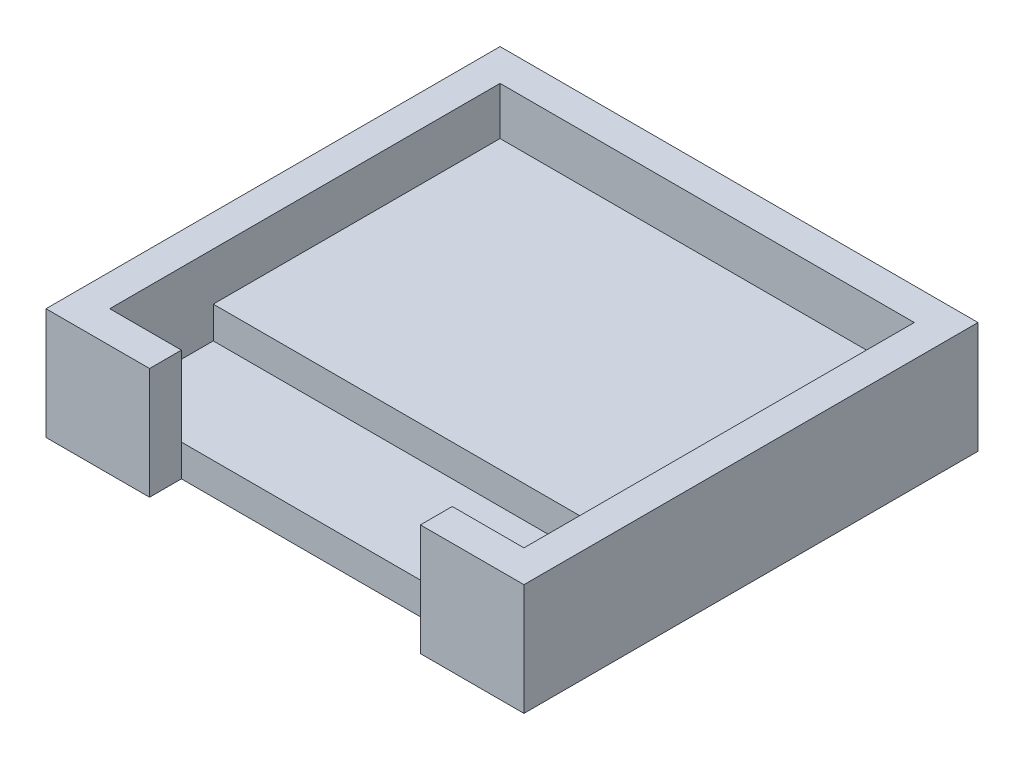
ISO-10303-21;
HEADER;
FILE_DESCRIPTION(('STEP AP214'),'2;1');
FILE_NAME('part.step','',(''),(''),'','','');
FILE_SCHEMA(('AUTOMOTIVE_DESIGN { 1 0 10303 214 1 1 1 1 }'));
ENDSEC;
DATA;
#1=APPLICATION_CONTEXT('core data for automotive mechanical design processes');
#2=APPLICATION_PROTOCOL_DEFINITION('international standard','automotive_design',2000,#1);
#3=PRODUCT_CONTEXT('',#1,'mechanical');
#4=PRODUCT('Part','Part','',(#3));
#5=PRODUCT_RELATED_PRODUCT_CATEGORY('part','',(#4));
#6=PRODUCT_DEFINITION_FORMATION('','',#4);
#7=PRODUCT_DEFINITION_CONTEXT('part definition',#1,'design');
#8=PRODUCT_DEFINITION('design','',#6,#7);
#9=PRODUCT_DEFINITION_SHAPE('','',#8);
#10=(LENGTH_UNIT() NAMED_UNIT(*) SI_UNIT(.MILLI.,.METRE.));
#11=(NAMED_UNIT(*) PLANE_ANGLE_UNIT() SI_UNIT($,.RADIAN.));
#12=(NAMED_UNIT(*) SI_UNIT($,.STERADIAN.) SOLID_ANGLE_UNIT());
#13=UNCERTAINTY_MEASURE_WITH_UNIT(LENGTH_MEASURE(1.E-05),#10,'distance_accuracy_value','');
#14=(GEOMETRIC_REPRESENTATION_CONTEXT(3) GLOBAL_UNCERTAINTY_ASSIGNED_CONTEXT((#13)) GLOBAL_UNIT_ASSIGNED_CONTEXT((#10,
#11,#12)) REPRESENTATION_CONTEXT('',''));
#15=CARTESIAN_POINT('',(0.,0.,0.));
#16=DIRECTION('',(0.,0.,1.));
#17=DIRECTION('',(1.,0.,0.));
#18=AXIS2_PLACEMENT_3D('',#15,#16,#17);
#19=CARTESIAN_POINT('',(0.,7.,0.));
#20=DIRECTION('',(-1.,0.,0.));
#21=DIRECTION('',(0.,0.,1.));
#22=AXIS2_PLACEMENT_3D('',#19,#20,#21);
#23=PLANE('',#22);
#24=DIRECTION('',(0.,-1.,0.));
#25=VECTOR('',#24,1.);
#26=CARTESIAN_POINT('',(0.,4.,-6.5));
#27=LINE('',#26,#25);
#28=CARTESIAN_POINT('',(0.,4.,-6.5));
#29=VERTEX_POINT('',#28);
#30=CARTESIAN_POINT('',(0.,2.,-6.5));
#31=VERTEX_POINT('',#30);
#32=EDGE_CURVE('E50',#29,#31,#27,.T.);
#33=ORIENTED_EDGE('',*,*,#32,.F.);
#34=DIRECTION('',(0.,0.,-1.));
#35=VECTOR('',#34,1.);
#36=CARTESIAN_POINT('',(0.,4.,0.));
#37=LINE('',#36,#35);
#38=CARTESIAN_POINT('',(0.,4.,-24.5));
#39=VERTEX_POINT('',#38);
#40=EDGE_CURVE('E55',#29,#39,#37,.T.);
#41=ORIENTED_EDGE('',*,*,#40,.T.);
#42=DIRECTION('',(0.,-1.,0.));
#43=VECTOR('',#42,1.);
#44=CARTESIAN_POINT('',(0.,7.,-24.5));
#45=LINE('',#44,#43);
#46=CARTESIAN_POINT('',(0.,7.,-24.5));
#47=VERTEX_POINT('',#46);
#48=EDGE_CURVE('E228',#47,#39,#45,.T.);
#49=ORIENTED_EDGE('',*,*,#48,.F.);
#50=DIRECTION('',(0.,0.,-1.));
#51=VECTOR('',#50,1.);
#52=CARTESIAN_POINT('',(0.,7.,0.));
#53=LINE('',#52,#51);
#54=CARTESIAN_POINT('',(0.,7.,0.));
#55=VERTEX_POINT('',#54);
#56=EDGE_CURVE('E200',#55,#47,#53,.T.);
#57=ORIENTED_EDGE('',*,*,#56,.F.);
#58=DIRECTION('',(0.,-1.,0.));
#59=VECTOR('',#58,1.);
#60=CARTESIAN_POINT('',(0.,7.,0.));
#61=LINE('',#60,#59);
#62=CARTESIAN_POINT('',(0.,2.,0.));
#63=VERTEX_POINT('',#62);
#64=EDGE_CURVE('E230',#55,#63,#61,.T.);
#65=ORIENTED_EDGE('',*,*,#64,.T.);
#66=DIRECTION('',(0.,0.,-1.));
#67=VECTOR('',#66,1.);
#68=CARTESIAN_POINT('',(0.,2.,0.));
#69=LINE('',#68,#67);
#70=EDGE_CURVE('E167',#63,#31,#69,.T.);
#71=ORIENTED_EDGE('',*,*,#70,.T.);
#72=EDGE_LOOP('',(#33,#41,#49,#57,#65,#71));
#73=FACE_BOUND('',#72,.T.);
#74=ADVANCED_FACE('F35',(#73),#23,.F.);
#75=CARTESIAN_POINT('',(26.,7.,0.));
#76=DIRECTION('',(-1.,0.,0.));
#77=DIRECTION('',(0.,0.,1.));
#78=AXIS2_PLACEMENT_3D('',#75,#76,#77);
#79=PLANE('',#78);
#80=DIRECTION('',(0.,0.,-1.));
#81=VECTOR('',#80,1.);
#82=CARTESIAN_POINT('',(26.,4.,0.));
#83=LINE('',#82,#81);
#84=CARTESIAN_POINT('',(26.,4.,-6.5));
#85=VERTEX_POINT('',#84);
#86=CARTESIAN_POINT('',(26.,4.,-24.5));
#87=VERTEX_POINT('',#86);
#88=EDGE_CURVE('E161',#85,#87,#83,.T.);
#89=ORIENTED_EDGE('',*,*,#88,.F.);
#90=DIRECTION('',(0.,-1.,0.));
#91=VECTOR('',#90,1.);
#92=CARTESIAN_POINT('',(26.,4.,-6.5));
#93=LINE('',#92,#91);
#94=CARTESIAN_POINT('',(26.,2.,-6.5));
#95=VERTEX_POINT('',#94);
#96=EDGE_CURVE('E157',#85,#95,#93,.T.);
#97=ORIENTED_EDGE('',*,*,#96,.T.);
#98=DIRECTION('',(0.,0.,-1.));
#99=VECTOR('',#98,1.);
#100=CARTESIAN_POINT('',(26.,2.,0.));
#101=LINE('',#100,#99);
#102=CARTESIAN_POINT('',(26.,2.,0.));
#103=VERTEX_POINT('',#102);
#104=EDGE_CURVE('E142',#103,#95,#101,.T.);
#105=ORIENTED_EDGE('',*,*,#104,.F.);
#106=DIRECTION('',(0.,-1.,0.));
#107=VECTOR('',#106,1.);
#108=CARTESIAN_POINT('',(26.,7.,0.));
#109=LINE('',#108,#107);
#110=CARTESIAN_POINT('',(26.,7.,0.));
#111=VERTEX_POINT('',#110);
#112=EDGE_CURVE('E207',#111,#103,#109,.T.);
#113=ORIENTED_EDGE('',*,*,#112,.F.);
#114=DIRECTION('',(0.,0.,-1.));
#115=VECTOR('',#114,1.);
#116=CARTESIAN_POINT('',(26.,7.,0.));
#117=LINE('',#116,#115);
#118=CARTESIAN_POINT('',(26.,7.,-24.5));
#119=VERTEX_POINT('',#118);
#120=EDGE_CURVE('E204',#111,#119,#117,.T.);
#121=ORIENTED_EDGE('',*,*,#120,.T.);
#122=DIRECTION('',(0.,-1.,0.));
#123=VECTOR('',#122,1.);
#124=CARTESIAN_POINT('',(26.,7.,-24.5));
#125=LINE('',#124,#123);
#126=EDGE_CURVE('E226',#119,#87,#125,.T.);
#127=ORIENTED_EDGE('',*,*,#126,.T.);
#128=EDGE_LOOP('',(#89,#97,#105,#113,#121,#127));
#129=FACE_BOUND('',#128,.T.);
#130=ADVANCED_FACE('F158',(#129),#79,.T.);
#131=CARTESIAN_POINT('',(0.,7.,0.));
#132=DIRECTION('',(0.,0.,-1.));
#133=DIRECTION('',(-1.,0.,0.));
#134=AXIS2_PLACEMENT_3D('',#131,#132,#133);
#135=PLANE('',#134);
#136=DIRECTION('',(1.,0.,0.));
#137=VECTOR('',#136,1.);
#138=CARTESIAN_POINT('',(0.,2.,0.));
#139=LINE('',#138,#137);
#140=CARTESIAN_POINT('',(21.5,2.,0.));
#141=VERTEX_POINT('',#140);
#142=EDGE_CURVE('E151',#141,#103,#139,.T.);
#143=ORIENTED_EDGE('',*,*,#142,.F.);
#144=DIRECTION('',(0.,-1.,0.));
#145=VECTOR('',#144,1.);
#146=CARTESIAN_POINT('',(21.5,7.,0.));
#147=LINE('',#146,#145);
#148=CARTESIAN_POINT('',(21.5,7.,0.));
#149=VERTEX_POINT('',#148);
#150=EDGE_CURVE('E11',#149,#141,#147,.T.);
#151=ORIENTED_EDGE('',*,*,#150,.F.);
#152=DIRECTION('',(1.,0.,0.));
#153=VECTOR('',#152,1.);
#154=CARTESIAN_POINT('',(0.,7.,0.));
#155=LINE('',#154,#153);
#156=EDGE_CURVE('E178',#149,#111,#155,.T.);
#157=ORIENTED_EDGE('',*,*,#156,.T.);
#158=ORIENTED_EDGE('',*,*,#112,.T.);
#159=EDGE_LOOP('',(#143,#151,#157,#158));
#160=FACE_BOUND('',#159,.T.);
#161=ADVANCED_FACE('F273',(#160),#135,.T.);
#162=CARTESIAN_POINT('',(21.5,7.,0.));
#163=DIRECTION('',(1.,0.,0.));
#164=DIRECTION('',(0.,0.,-1.));
#165=AXIS2_PLACEMENT_3D('',#162,#163,#164);
#166=PLANE('',#165);
#167=DIRECTION('',(0.,0.,1.));
#168=VECTOR('',#167,1.);
#169=CARTESIAN_POINT('',(21.5,0.,0.));
#170=LINE('',#169,#168);
#171=CARTESIAN_POINT('',(21.5,0.,0.));
#172=VERTEX_POINT('',#171);
#173=CARTESIAN_POINT('',(21.5,0.,2.));
#174=VERTEX_POINT('',#173);
#175=EDGE_CURVE('E177',#172,#174,#170,.T.);
#176=ORIENTED_EDGE('',*,*,#175,.T.);
#177=DIRECTION('',(0.,-1.,0.));
#178=VECTOR('',#177,1.);
#179=CARTESIAN_POINT('',(21.5,7.,2.));
#180=LINE('',#179,#178);
#181=CARTESIAN_POINT('',(21.5,7.,2.));
#182=VERTEX_POINT('',#181);
#183=EDGE_CURVE('E43',#182,#174,#180,.T.);
#184=ORIENTED_EDGE('',*,*,#183,.F.);
#185=DIRECTION('',(0.,0.,1.));
#186=VECTOR('',#185,1.);
#187=CARTESIAN_POINT('',(21.5,7.,0.));
#188=LINE('',#187,#186);
#189=EDGE_CURVE('E181',#149,#182,#188,.T.);
#190=ORIENTED_EDGE('',*,*,#189,.F.);
#191=ORIENTED_EDGE('',*,*,#150,.T.);
#192=DIRECTION('',(0.,1.,0.));
#193=VECTOR('',#192,1.);
#194=CARTESIAN_POINT('',(21.5,7.,0.));
#195=LINE('',#194,#193);
#196=EDGE_CURVE('E175',#172,#141,#195,.T.);
#197=ORIENTED_EDGE('',*,*,#196,.F.);
#198=EDGE_LOOP('',(#176,#184,#190,#191,#197));
#199=FACE_BOUND('',#198,.T.);
#200=ADVANCED_FACE('F37',(#199),#166,.F.);
#201=CARTESIAN_POINT('',(0.,7.,2.));
#202=DIRECTION('',(0.,0.,-1.));
#203=DIRECTION('',(-1.,0.,0.));
#204=AXIS2_PLACEMENT_3D('',#201,#202,#203);
#205=PLANE('',#204);
#206=DIRECTION('',(1.,0.,0.));
#207=VECTOR('',#206,1.);
#208=CARTESIAN_POINT('',(0.,0.,2.));
#209=LINE('',#208,#207);
#210=CARTESIAN_POINT('',(28.,0.,2.));
#211=VERTEX_POINT('',#210);
#212=EDGE_CURVE('E209',#174,#211,#209,.T.);
#213=ORIENTED_EDGE('',*,*,#212,.T.);
#214=DIRECTION('',(0.,-1.,0.));
#215=VECTOR('',#214,1.);
#216=CARTESIAN_POINT('',(28.,7.,2.));
#217=LINE('',#216,#215);
#218=CARTESIAN_POINT('',(28.,7.,2.));
#219=VERTEX_POINT('',#218);
#220=EDGE_CURVE('E244',#219,#211,#217,.T.);
#221=ORIENTED_EDGE('',*,*,#220,.F.);
#222=DIRECTION('',(1.,0.,0.));
#223=VECTOR('',#222,1.);
#224=CARTESIAN_POINT('',(0.,7.,2.));
#225=LINE('',#224,#223);
#226=EDGE_CURVE('E185',#182,#219,#225,.T.);
#227=ORIENTED_EDGE('',*,*,#226,.F.);
#228=ORIENTED_EDGE('',*,*,#183,.T.);
#229=EDGE_LOOP('',(#213,#221,#227,#228));
#230=FACE_BOUND('',#229,.T.);
#231=ADVANCED_FACE('F251',(#230),#205,.F.);
#232=CARTESIAN_POINT('',(28.,7.,0.));
#233=DIRECTION('',(-1.,0.,0.));
#234=DIRECTION('',(0.,0.,1.));
#235=AXIS2_PLACEMENT_3D('',#232,#233,#234);
#236=PLANE('',#235);
#237=DIRECTION('',(0.,0.,-1.));
#238=VECTOR('',#237,1.);
#239=CARTESIAN_POINT('',(28.,0.,0.));
#240=LINE('',#239,#238);
#241=CARTESIAN_POINT('',(28.,0.,-26.5));
#242=VERTEX_POINT('',#241);
#243=EDGE_CURVE('E211',#211,#242,#240,.T.);
#244=ORIENTED_EDGE('',*,*,#243,.T.);
#245=DIRECTION('',(0.,-1.,0.));
#246=VECTOR('',#245,1.);
#247=CARTESIAN_POINT('',(28.,7.,-26.5));
#248=LINE('',#247,#246);
#249=CARTESIAN_POINT('',(28.,7.,-26.5));
#250=VERTEX_POINT('',#249);
#251=EDGE_CURVE('E242',#250,#242,#248,.T.);
#252=ORIENTED_EDGE('',*,*,#251,.F.);
#253=DIRECTION('',(0.,0.,-1.));
#254=VECTOR('',#253,1.);
#255=CARTESIAN_POINT('',(28.,7.,0.));
#256=LINE('',#255,#254);
#257=EDGE_CURVE('E187',#219,#250,#256,.T.);
#258=ORIENTED_EDGE('',*,*,#257,.F.);
#259=ORIENTED_EDGE('',*,*,#220,.T.);
#260=EDGE_LOOP('',(#244,#252,#258,#259));
#261=FACE_BOUND('',#260,.T.);
#262=ADVANCED_FACE('F263',(#261),#236,.F.);
#263=CARTESIAN_POINT('',(0.,7.,-26.5));
#264=DIRECTION('',(0.,0.,-1.));
#265=DIRECTION('',(-1.,0.,0.));
#266=AXIS2_PLACEMENT_3D('',#263,#264,#265);
#267=PLANE('',#266);
#268=DIRECTION('',(1.,0.,0.));
#269=VECTOR('',#268,1.);
#270=CARTESIAN_POINT('',(0.,0.,-26.5));
#271=LINE('',#270,#269);
#272=CARTESIAN_POINT('',(-2.,0.,-26.5));
#273=VERTEX_POINT('',#272);
#274=EDGE_CURVE('E214',#273,#242,#271,.T.);
#275=ORIENTED_EDGE('',*,*,#274,.F.);
#276=DIRECTION('',(0.,-1.,0.));
#277=VECTOR('',#276,1.);
#278=CARTESIAN_POINT('',(-2.,7.,-26.5));
#279=LINE('',#278,#277);
#280=CARTESIAN_POINT('',(-2.,7.,-26.5));
#281=VERTEX_POINT('',#280);
#282=EDGE_CURVE('E240',#281,#273,#279,.T.);
#283=ORIENTED_EDGE('',*,*,#282,.F.);
#284=DIRECTION('',(1.,0.,0.));
#285=VECTOR('',#284,1.);
#286=CARTESIAN_POINT('',(0.,7.,-26.5));
#287=LINE('',#286,#285);
#288=EDGE_CURVE('E189',#281,#250,#287,.T.);
#289=ORIENTED_EDGE('',*,*,#288,.T.);
#290=ORIENTED_EDGE('',*,*,#251,.T.);
#291=EDGE_LOOP('',(#275,#283,#289,#290));
#292=FACE_BOUND('',#291,.T.);
#293=ADVANCED_FACE('F296',(#292),#267,.T.);
#294=CARTESIAN_POINT('',(-2.,7.,0.));
#295=DIRECTION('',(-1.,0.,0.));
#296=DIRECTION('',(0.,0.,1.));
#297=AXIS2_PLACEMENT_3D('',#294,#295,#296);
#298=PLANE('',#297);
#299=DIRECTION('',(0.,0.,-1.));
#300=VECTOR('',#299,1.);
#301=CARTESIAN_POINT('',(-2.,0.,0.));
#302=LINE('',#301,#300);
#303=CARTESIAN_POINT('',(-2.,0.,2.));
#304=VERTEX_POINT('',#303);
#305=EDGE_CURVE('E217',#304,#273,#302,.T.);
#306=ORIENTED_EDGE('',*,*,#305,.F.);
#307=DIRECTION('',(0.,-1.,0.));
#308=VECTOR('',#307,1.);
#309=CARTESIAN_POINT('',(-2.,7.,2.));
#310=LINE('',#309,#308);
#311=CARTESIAN_POINT('',(-2.,7.,2.));
#312=VERTEX_POINT('',#311);
#313=EDGE_CURVE('E238',#312,#304,#310,.T.);
#314=ORIENTED_EDGE('',*,*,#313,.F.);
#315=DIRECTION('',(0.,0.,-1.));
#316=VECTOR('',#315,1.);
#317=CARTESIAN_POINT('',(-2.,7.,0.));
#318=LINE('',#317,#316);
#319=EDGE_CURVE('E192',#312,#281,#318,.T.);
#320=ORIENTED_EDGE('',*,*,#319,.T.);
#321=ORIENTED_EDGE('',*,*,#282,.T.);
#322=EDGE_LOOP('',(#306,#314,#320,#321));
#323=FACE_BOUND('',#322,.T.);
#324=ADVANCED_FACE('F294',(#323),#298,.T.);
#325=CARTESIAN_POINT('',(0.,7.,2.));
#326=DIRECTION('',(0.,0.,-1.));
#327=DIRECTION('',(-1.,0.,0.));
#328=AXIS2_PLACEMENT_3D('',#325,#326,#327);
#329=PLANE('',#328);
#330=DIRECTION('',(1.,0.,0.));
#331=VECTOR('',#330,1.);
#332=CARTESIAN_POINT('',(0.,0.,2.));
#333=LINE('',#332,#331);
#334=CARTESIAN_POINT('',(4.5,0.,2.));
#335=VERTEX_POINT('',#334);
#336=EDGE_CURVE('E220',#304,#335,#333,.T.);
#337=ORIENTED_EDGE('',*,*,#336,.T.);
#338=DIRECTION('',(0.,-1.,0.));
#339=VECTOR('',#338,1.);
#340=CARTESIAN_POINT('',(4.5,7.,2.));
#341=LINE('',#340,#339);
#342=CARTESIAN_POINT('',(4.5,7.,2.));
#343=VERTEX_POINT('',#342);
#344=EDGE_CURVE('E236',#343,#335,#341,.T.);
#345=ORIENTED_EDGE('',*,*,#344,.F.);
#346=DIRECTION('',(1.,0.,0.));
#347=VECTOR('',#346,1.);
#348=CARTESIAN_POINT('',(0.,7.,2.));
#349=LINE('',#348,#347);
#350=EDGE_CURVE('E195',#312,#343,#349,.T.);
#351=ORIENTED_EDGE('',*,*,#350,.F.);
#352=ORIENTED_EDGE('',*,*,#313,.T.);
#353=EDGE_LOOP('',(#337,#345,#351,#352));
#354=FACE_BOUND('',#353,.T.);
#355=ADVANCED_FACE('F303',(#354),#329,.F.);
#356=CARTESIAN_POINT('',(4.5,7.,0.));
#357=DIRECTION('',(1.,0.,0.));
#358=DIRECTION('',(0.,0.,-1.));
#359=AXIS2_PLACEMENT_3D('',#356,#357,#358);
#360=PLANE('',#359);
#361=DIRECTION('',(0.,0.,1.));
#362=VECTOR('',#361,1.);
#363=CARTESIAN_POINT('',(4.5,0.,0.));
#364=LINE('',#363,#362);
#365=CARTESIAN_POINT('',(4.5,0.,0.));
#366=VERTEX_POINT('',#365);
#367=EDGE_CURVE('E182',#366,#335,#364,.T.);
#368=ORIENTED_EDGE('',*,*,#367,.F.);
#369=DIRECTION('',(0.,1.,0.));
#370=VECTOR('',#369,1.);
#371=CARTESIAN_POINT('',(4.5,7.,0.));
#372=LINE('',#371,#370);
#373=CARTESIAN_POINT('',(4.5,2.,0.));
#374=VERTEX_POINT('',#373);
#375=EDGE_CURVE('E169',#366,#374,#372,.T.);
#376=ORIENTED_EDGE('',*,*,#375,.T.);
#377=DIRECTION('',(0.,-1.,0.));
#378=VECTOR('',#377,1.);
#379=CARTESIAN_POINT('',(4.5,7.,0.));
#380=LINE('',#379,#378);
#381=CARTESIAN_POINT('',(4.5,7.,0.));
#382=VERTEX_POINT('',#381);
#383=EDGE_CURVE('E233',#382,#374,#380,.T.);
#384=ORIENTED_EDGE('',*,*,#383,.F.);
#385=DIRECTION('',(0.,0.,1.));
#386=VECTOR('',#385,1.);
#387=CARTESIAN_POINT('',(4.5,7.,0.));
#388=LINE('',#387,#386);
#389=EDGE_CURVE('E197',#382,#343,#388,.T.);
#390=ORIENTED_EDGE('',*,*,#389,.T.);
#391=ORIENTED_EDGE('',*,*,#344,.T.);
#392=EDGE_LOOP('',(#368,#376,#384,#390,#391));
#393=FACE_BOUND('',#392,.T.);
#394=ADVANCED_FACE('F286',(#393),#360,.T.);
#395=EDGE_CURVE('E154',#63,#374,#139,.T.);
#396=ORIENTED_EDGE('',*,*,#395,.F.);
#397=ORIENTED_EDGE('',*,*,#64,.F.);
#398=EDGE_CURVE('E183',#55,#382,#155,.T.);
#399=ORIENTED_EDGE('',*,*,#398,.T.);
#400=ORIENTED_EDGE('',*,*,#383,.T.);
#401=EDGE_LOOP('',(#396,#397,#399,#400));
#402=FACE_BOUND('',#401,.T.);
#403=ADVANCED_FACE('F277',(#402),#135,.T.);
#404=CARTESIAN_POINT('',(0.,7.,-24.5));
#405=DIRECTION('',(0.,0.,-1.));
#406=DIRECTION('',(-1.,0.,0.));
#407=AXIS2_PLACEMENT_3D('',#404,#405,#406);
#408=PLANE('',#407);
#409=ORIENTED_EDGE('',*,*,#48,.T.);
#410=DIRECTION('',(1.,0.,0.));
#411=VECTOR('',#410,1.);
#412=CARTESIAN_POINT('',(0.,4.,-24.5));
#413=LINE('',#412,#411);
#414=EDGE_CURVE('E461',#39,#87,#413,.T.);
#415=ORIENTED_EDGE('',*,*,#414,.T.);
#416=ORIENTED_EDGE('',*,*,#126,.F.);
#417=DIRECTION('',(1.,0.,0.));
#418=VECTOR('',#417,1.);
#419=CARTESIAN_POINT('',(0.,7.,-24.5));
#420=LINE('',#419,#418);
#421=EDGE_CURVE('E202',#47,#119,#420,.T.);
#422=ORIENTED_EDGE('',*,*,#421,.F.);
#423=EDGE_LOOP('',(#409,#415,#416,#422));
#424=FACE_BOUND('',#423,.T.);
#425=ADVANCED_FACE('F314',(#424),#408,.F.);
#426=CARTESIAN_POINT('',(0.,7.,0.));
#427=DIRECTION('',(0.,1.,0.));
#428=DIRECTION('',(0.,0.,1.));
#429=AXIS2_PLACEMENT_3D('',#426,#427,#428);
#430=PLANE('',#429);
#431=ORIENTED_EDGE('',*,*,#156,.F.);
#432=ORIENTED_EDGE('',*,*,#189,.T.);
#433=ORIENTED_EDGE('',*,*,#226,.T.);
#434=ORIENTED_EDGE('',*,*,#257,.T.);
#435=ORIENTED_EDGE('',*,*,#288,.F.);
#436=ORIENTED_EDGE('',*,*,#319,.F.);
#437=ORIENTED_EDGE('',*,*,#350,.T.);
#438=ORIENTED_EDGE('',*,*,#389,.F.);
#439=ORIENTED_EDGE('',*,*,#398,.F.);
#440=ORIENTED_EDGE('',*,*,#56,.T.);
#441=ORIENTED_EDGE('',*,*,#421,.T.);
#442=ORIENTED_EDGE('',*,*,#120,.F.);
#443=EDGE_LOOP('',(#431,#432,#433,#434,#435,#436,#437,#438,#439,#440,#441,#442));
#444=FACE_BOUND('',#443,.T.);
#445=ADVANCED_FACE('F268',(#444),#430,.T.);
#446=CARTESIAN_POINT('',(0.,0.,0.));
#447=DIRECTION('',(0.,1.,0.));
#448=DIRECTION('',(0.,0.,1.));
#449=AXIS2_PLACEMENT_3D('',#446,#447,#448);
#450=PLANE('',#449);
#451=DIRECTION('',(1.,0.,0.));
#452=VECTOR('',#451,1.);
#453=CARTESIAN_POINT('',(0.,0.,0.));
#454=LINE('',#453,#452);
#455=EDGE_CURVE('E164',#366,#172,#454,.T.);
#456=ORIENTED_EDGE('',*,*,#455,.F.);
#457=ORIENTED_EDGE('',*,*,#367,.T.);
#458=ORIENTED_EDGE('',*,*,#336,.F.);
#459=ORIENTED_EDGE('',*,*,#305,.T.);
#460=ORIENTED_EDGE('',*,*,#274,.T.);
#461=ORIENTED_EDGE('',*,*,#243,.F.);
#462=ORIENTED_EDGE('',*,*,#212,.F.);
#463=ORIENTED_EDGE('',*,*,#175,.F.);
#464=EDGE_LOOP('',(#456,#457,#458,#459,#460,#461,#462,#463));
#465=FACE_BOUND('',#464,.T.);
#466=ADVANCED_FACE('F259',(#465),#450,.F.);
#467=CARTESIAN_POINT('',(0.,2.,0.));
#468=DIRECTION('',(0.,0.,-1.));
#469=DIRECTION('',(-1.,0.,0.));
#470=AXIS2_PLACEMENT_3D('',#467,#468,#469);
#471=PLANE('',#470);
#472=ORIENTED_EDGE('',*,*,#455,.T.);
#473=ORIENTED_EDGE('',*,*,#196,.T.);
#474=EDGE_CURVE('E274',#374,#141,#139,.T.);
#475=ORIENTED_EDGE('',*,*,#474,.F.);
#476=ORIENTED_EDGE('',*,*,#375,.F.);
#477=EDGE_LOOP('',(#472,#473,#475,#476));
#478=FACE_BOUND('',#477,.T.);
#479=ADVANCED_FACE('F289',(#478),#471,.F.);
#480=CARTESIAN_POINT('',(0.,2.,0.));
#481=DIRECTION('',(0.,1.,0.));
#482=DIRECTION('',(0.,0.,1.));
#483=AXIS2_PLACEMENT_3D('',#480,#481,#482);
#484=PLANE('',#483);
#485=ORIENTED_EDGE('',*,*,#395,.T.);
#486=ORIENTED_EDGE('',*,*,#474,.T.);
#487=ORIENTED_EDGE('',*,*,#142,.T.);
#488=ORIENTED_EDGE('',*,*,#104,.T.);
#489=DIRECTION('',(1.,0.,0.));
#490=VECTOR('',#489,1.);
#491=CARTESIAN_POINT('',(0.,2.,-6.5));
#492=LINE('',#491,#490);
#493=EDGE_CURVE('E148',#31,#95,#492,.T.);
#494=ORIENTED_EDGE('',*,*,#493,.F.);
#495=ORIENTED_EDGE('',*,*,#70,.F.);
#496=EDGE_LOOP('',(#485,#486,#487,#488,#494,#495));
#497=FACE_BOUND('',#496,.T.);
#498=ADVANCED_FACE('F145',(#497),#484,.T.);
#499=CARTESIAN_POINT('',(0.,4.,0.));
#500=DIRECTION('',(0.,1.,0.));
#501=DIRECTION('',(0.,0.,1.));
#502=AXIS2_PLACEMENT_3D('',#499,#500,#501);
#503=PLANE('',#502);
#504=DIRECTION('',(1.,0.,0.));
#505=VECTOR('',#504,1.);
#506=CARTESIAN_POINT('',(0.,4.,-6.5));
#507=LINE('',#506,#505);
#508=EDGE_CURVE('E458',#29,#85,#507,.T.);
#509=ORIENTED_EDGE('',*,*,#508,.T.);
#510=ORIENTED_EDGE('',*,*,#88,.T.);
#511=ORIENTED_EDGE('',*,*,#414,.F.);
#512=ORIENTED_EDGE('',*,*,#40,.F.);
#513=EDGE_LOOP('',(#509,#510,#511,#512));
#514=FACE_BOUND('',#513,.T.);
#515=ADVANCED_FACE('F365',(#514),#503,.T.);
#516=CARTESIAN_POINT('',(0.,4.,-6.5));
#517=DIRECTION('',(0.,0.,-1.));
#518=DIRECTION('',(-1.,0.,0.));
#519=AXIS2_PLACEMENT_3D('',#516,#517,#518);
#520=PLANE('',#519);
#521=ORIENTED_EDGE('',*,*,#493,.T.);
#522=ORIENTED_EDGE('',*,*,#96,.F.);
#523=ORIENTED_EDGE('',*,*,#508,.F.);
#524=ORIENTED_EDGE('',*,*,#32,.T.);
#525=EDGE_LOOP('',(#521,#522,#523,#524));
#526=FACE_BOUND('',#525,.T.);
#527=ADVANCED_FACE('F166',(#526),#520,.F.);
#528=CLOSED_SHELL('',(#74,#130,#161,#200,#231,#262,#293,#324,#355,#394,#403,#425,#445,#466,#479,
#498,#515,#527));
#529=MANIFOLD_SOLID_BREP('B2',#528);
#530=ADVANCED_BREP_SHAPE_REPRESENTATION('',(#18,#529),#14);
#531=SHAPE_DEFINITION_REPRESENTATION(#9,#530);
ENDSEC;
END-ISO-10303-21;
